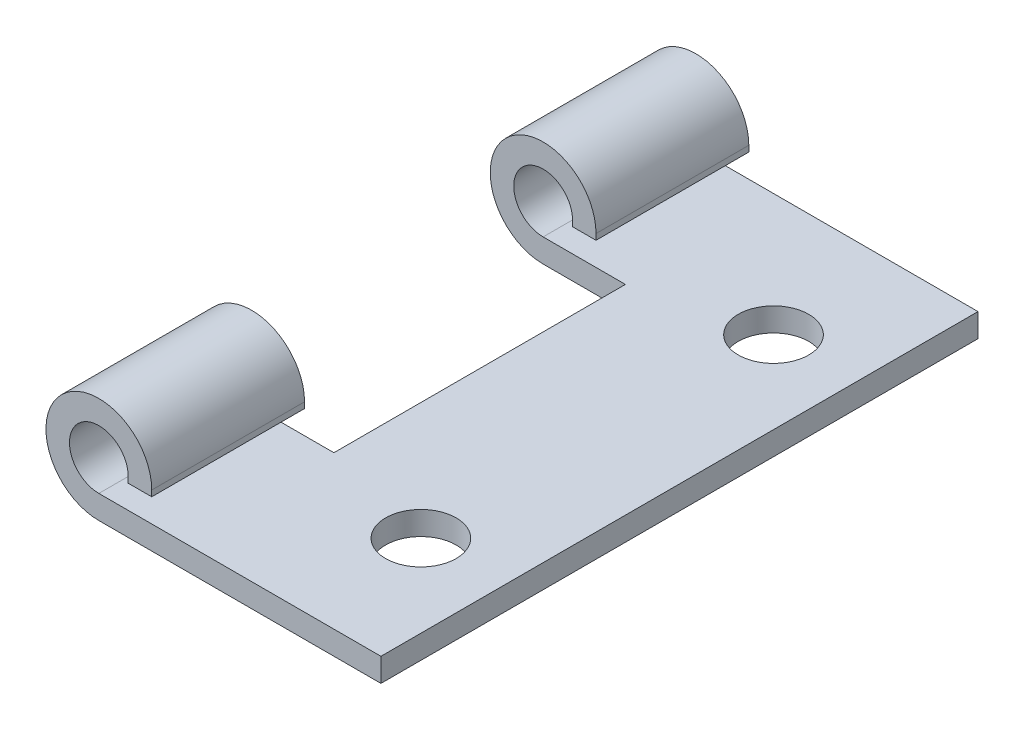
ISO-10303-21;
HEADER;
FILE_DESCRIPTION(('STEP AP214'),'2;1');
FILE_NAME('part.step','',(''),(''),'','','');
FILE_SCHEMA(('AUTOMOTIVE_DESIGN { 1 0 10303 214 1 1 1 1 }'));
ENDSEC;
DATA;
#1=APPLICATION_CONTEXT('core data for automotive mechanical design processes');
#2=APPLICATION_PROTOCOL_DEFINITION('international standard','automotive_design',2000,#1);
#3=PRODUCT_CONTEXT('',#1,'mechanical');
#4=PRODUCT('Part','Part','',(#3));
#5=PRODUCT_RELATED_PRODUCT_CATEGORY('part','',(#4));
#6=PRODUCT_DEFINITION_FORMATION('','',#4);
#7=PRODUCT_DEFINITION_CONTEXT('part definition',#1,'design');
#8=PRODUCT_DEFINITION('design','',#6,#7);
#9=PRODUCT_DEFINITION_SHAPE('','',#8);
#10=(LENGTH_UNIT() NAMED_UNIT(*) SI_UNIT(.MILLI.,.METRE.));
#11=(NAMED_UNIT(*) PLANE_ANGLE_UNIT() SI_UNIT($,.RADIAN.));
#12=(NAMED_UNIT(*) SI_UNIT($,.STERADIAN.) SOLID_ANGLE_UNIT());
#13=UNCERTAINTY_MEASURE_WITH_UNIT(LENGTH_MEASURE(1.E-05),#10,'distance_accuracy_value','');
#14=(GEOMETRIC_REPRESENTATION_CONTEXT(3) GLOBAL_UNCERTAINTY_ASSIGNED_CONTEXT((#13)) GLOBAL_UNIT_ASSIGNED_CONTEXT((#10,
#11,#12)) REPRESENTATION_CONTEXT('',''));
#15=CARTESIAN_POINT('',(0.,0.,0.));
#16=DIRECTION('',(0.,0.,1.));
#17=DIRECTION('',(1.,0.,0.));
#18=AXIS2_PLACEMENT_3D('',#15,#16,#17);
#19=CARTESIAN_POINT('',(0.,0.,25.4));
#20=DIRECTION('',(0.,0.,-1.));
#21=DIRECTION('',(-1.,0.,0.));
#22=AXIS2_PLACEMENT_3D('',#19,#20,#21);
#23=CYLINDRICAL_SURFACE('',#22,1.25);
#24=DIRECTION('',(0.,0.,-1.));
#25=VECTOR('',#24,1.);
#26=CARTESIAN_POINT('',(0.,-1.25,25.4));
#27=LINE('',#26,#25);
#28=CARTESIAN_POINT('',(0.,-1.25,25.4));
#29=VERTEX_POINT('',#28);
#30=CARTESIAN_POINT('',(0.,-1.25,18.9));
#31=VERTEX_POINT('',#30);
#32=EDGE_CURVE('E192',#29,#31,#27,.T.);
#33=ORIENTED_EDGE('',*,*,#32,.T.);
#34=CARTESIAN_POINT('',(0.,0.,18.9));
#35=DIRECTION('',(0.,0.,1.));
#36=DIRECTION('',(1.,0.,0.));
#37=AXIS2_PLACEMENT_3D('',#34,#35,#36);
#38=CIRCLE('',#37,1.25);
#39=CARTESIAN_POINT('',(1.25,0.,18.9));
#40=VERTEX_POINT('',#39);
#41=EDGE_CURVE('E292',#31,#40,#38,.F.);
#42=ORIENTED_EDGE('',*,*,#41,.T.);
#43=DIRECTION('',(0.,0.,-1.));
#44=VECTOR('',#43,1.);
#45=CARTESIAN_POINT('',(1.25,0.,25.4));
#46=LINE('',#45,#44);
#47=CARTESIAN_POINT('',(1.25,0.,25.4));
#48=VERTEX_POINT('',#47);
#49=EDGE_CURVE('E217',#48,#40,#46,.T.);
#50=ORIENTED_EDGE('',*,*,#49,.F.);
#51=CARTESIAN_POINT('',(0.,0.,25.4));
#52=DIRECTION('',(0.,0.,-1.));
#53=DIRECTION('',(1.,0.,0.));
#54=AXIS2_PLACEMENT_3D('',#51,#52,#53);
#55=CIRCLE('',#54,1.25);
#56=EDGE_CURVE('E191',#29,#48,#55,.T.);
#57=ORIENTED_EDGE('',*,*,#56,.F.);
#58=EDGE_LOOP('',(#33,#42,#50,#57));
#59=FACE_BOUND('',#58,.T.);
#60=ADVANCED_FACE('F47',(#59),#23,.F.);
#61=CARTESIAN_POINT('',(1.25,0.,25.4));
#62=DIRECTION('',(1.,0.,0.));
#63=DIRECTION('',(0.,0.,-1.));
#64=AXIS2_PLACEMENT_3D('',#61,#62,#63);
#65=PLANE('',#64);
#66=ORIENTED_EDGE('',*,*,#49,.T.);
#67=DIRECTION('',(0.,-1.,0.));
#68=VECTOR('',#67,1.);
#69=CARTESIAN_POINT('',(1.25,0.,18.9));
#70=LINE('',#69,#68);
#71=CARTESIAN_POINT('',(1.25,-0.250000000000001,18.9));
#72=VERTEX_POINT('',#71);
#73=EDGE_CURVE('E296',#40,#72,#70,.T.);
#74=ORIENTED_EDGE('',*,*,#73,.T.);
#75=DIRECTION('',(0.,0.,-1.));
#76=VECTOR('',#75,1.);
#77=CARTESIAN_POINT('',(1.25,-0.250000000000001,25.4));
#78=LINE('',#77,#76);
#79=CARTESIAN_POINT('',(1.25,-0.250000000000001,25.4));
#80=VERTEX_POINT('',#79);
#81=EDGE_CURVE('E212',#80,#72,#78,.T.);
#82=ORIENTED_EDGE('',*,*,#81,.F.);
#83=DIRECTION('',(0.,-1.,0.));
#84=VECTOR('',#83,1.);
#85=CARTESIAN_POINT('',(1.25,0.,25.4));
#86=LINE('',#85,#84);
#87=EDGE_CURVE('E115',#48,#80,#86,.T.);
#88=ORIENTED_EDGE('',*,*,#87,.F.);
#89=EDGE_LOOP('',(#66,#74,#82,#88));
#90=FACE_BOUND('',#89,.T.);
#91=ADVANCED_FACE('F352',(#90),#65,.F.);
#92=CARTESIAN_POINT('',(2.25,-0.250000000000001,25.4));
#93=DIRECTION('',(0.,1.,0.));
#94=DIRECTION('',(0.,0.,1.));
#95=AXIS2_PLACEMENT_3D('',#92,#93,#94);
#96=PLANE('',#95);
#97=ORIENTED_EDGE('',*,*,#81,.T.);
#98=DIRECTION('',(1.,0.,0.));
#99=VECTOR('',#98,1.);
#100=CARTESIAN_POINT('',(2.25,-0.250000000000001,18.9));
#101=LINE('',#100,#99);
#102=CARTESIAN_POINT('',(2.25,-0.250000000000001,18.9));
#103=VERTEX_POINT('',#102);
#104=EDGE_CURVE('E300',#72,#103,#101,.T.);
#105=ORIENTED_EDGE('',*,*,#104,.T.);
#106=DIRECTION('',(0.,0.,-1.));
#107=VECTOR('',#106,1.);
#108=CARTESIAN_POINT('',(2.25,-0.250000000000001,25.4));
#109=LINE('',#108,#107);
#110=CARTESIAN_POINT('',(2.25,-0.250000000000001,25.4));
#111=VERTEX_POINT('',#110);
#112=EDGE_CURVE('E207',#111,#103,#109,.T.);
#113=ORIENTED_EDGE('',*,*,#112,.F.);
#114=DIRECTION('',(1.,0.,0.));
#115=VECTOR('',#114,1.);
#116=CARTESIAN_POINT('',(1.25,-0.250000000000001,25.4));
#117=LINE('',#116,#115);
#118=EDGE_CURVE('E315',#80,#111,#117,.T.);
#119=ORIENTED_EDGE('',*,*,#118,.F.);
#120=EDGE_LOOP('',(#97,#105,#113,#119));
#121=FACE_BOUND('',#120,.T.);
#122=ADVANCED_FACE('F358',(#121),#96,.F.);
#123=CARTESIAN_POINT('',(2.25,0.,25.4));
#124=DIRECTION('',(-1.,0.,0.));
#125=DIRECTION('',(0.,0.,1.));
#126=AXIS2_PLACEMENT_3D('',#123,#124,#125);
#127=PLANE('',#126);
#128=ORIENTED_EDGE('',*,*,#112,.T.);
#129=DIRECTION('',(0.,1.,0.));
#130=VECTOR('',#129,1.);
#131=CARTESIAN_POINT('',(2.25,0.,18.9));
#132=LINE('',#131,#130);
#133=CARTESIAN_POINT('',(2.25,0.,18.9));
#134=VERTEX_POINT('',#133);
#135=EDGE_CURVE('E304',#103,#134,#132,.T.);
#136=ORIENTED_EDGE('',*,*,#135,.T.);
#137=DIRECTION('',(0.,0.,-1.));
#138=VECTOR('',#137,1.);
#139=CARTESIAN_POINT('',(2.25,0.,25.4));
#140=LINE('',#139,#138);
#141=CARTESIAN_POINT('',(2.25,0.,25.4));
#142=VERTEX_POINT('',#141);
#143=EDGE_CURVE('E202',#142,#134,#140,.T.);
#144=ORIENTED_EDGE('',*,*,#143,.F.);
#145=DIRECTION('',(0.,1.,0.));
#146=VECTOR('',#145,1.);
#147=CARTESIAN_POINT('',(2.25,0.,25.4));
#148=LINE('',#147,#146);
#149=EDGE_CURVE('E318',#111,#142,#148,.T.);
#150=ORIENTED_EDGE('',*,*,#149,.F.);
#151=EDGE_LOOP('',(#128,#136,#144,#150));
#152=FACE_BOUND('',#151,.T.);
#153=ADVANCED_FACE('F368',(#152),#127,.F.);
#154=CARTESIAN_POINT('',(0.,0.,25.4));
#155=DIRECTION('',(0.,0.,-1.));
#156=DIRECTION('',(-1.,0.,0.));
#157=AXIS2_PLACEMENT_3D('',#154,#155,#156);
#158=CYLINDRICAL_SURFACE('',#157,2.25);
#159=ORIENTED_EDGE('',*,*,#143,.T.);
#160=CARTESIAN_POINT('',(0.,0.,18.9));
#161=DIRECTION('',(0.,0.,1.));
#162=DIRECTION('',(1.,0.,0.));
#163=AXIS2_PLACEMENT_3D('',#160,#161,#162);
#164=CIRCLE('',#163,2.25);
#165=CARTESIAN_POINT('',(0.,-2.25,18.9));
#166=VERTEX_POINT('',#165);
#167=EDGE_CURVE('E167',#134,#166,#164,.T.);
#168=ORIENTED_EDGE('',*,*,#167,.T.);
#169=DIRECTION('',(0.,0.,-1.));
#170=VECTOR('',#169,1.);
#171=CARTESIAN_POINT('',(0.,-2.25,25.4));
#172=LINE('',#171,#170);
#173=CARTESIAN_POINT('',(0.,-2.25,25.4));
#174=VERTEX_POINT('',#173);
#175=EDGE_CURVE('E198',#174,#166,#172,.T.);
#176=ORIENTED_EDGE('',*,*,#175,.F.);
#177=CARTESIAN_POINT('',(0.,0.,25.4));
#178=DIRECTION('',(0.,0.,1.));
#179=DIRECTION('',(1.,0.,0.));
#180=AXIS2_PLACEMENT_3D('',#177,#178,#179);
#181=CIRCLE('',#180,2.25);
#182=EDGE_CURVE('E137',#142,#174,#181,.T.);
#183=ORIENTED_EDGE('',*,*,#182,.F.);
#184=EDGE_LOOP('',(#159,#168,#176,#183));
#185=FACE_BOUND('',#184,.T.);
#186=ADVANCED_FACE('F361',(#185),#158,.T.);
#187=CARTESIAN_POINT('',(1.25,0.,6.5));
#188=VERTEX_POINT('',#187);
#189=CARTESIAN_POINT('',(1.25,0.,0.));
#190=VERTEX_POINT('',#189);
#191=EDGE_CURVE('E216',#188,#190,#46,.T.);
#192=ORIENTED_EDGE('',*,*,#191,.F.);
#193=CARTESIAN_POINT('',(0.,0.,6.5));
#194=DIRECTION('',(0.,0.,-1.));
#195=DIRECTION('',(-1.,0.,0.));
#196=AXIS2_PLACEMENT_3D('',#193,#194,#195);
#197=CIRCLE('',#196,1.25);
#198=CARTESIAN_POINT('',(0.,-1.25,6.5));
#199=VERTEX_POINT('',#198);
#200=EDGE_CURVE('E230',#188,#199,#197,.F.);
#201=ORIENTED_EDGE('',*,*,#200,.T.);
#202=CARTESIAN_POINT('',(0.,-1.25,0.));
#203=VERTEX_POINT('',#202);
#204=EDGE_CURVE('E106',#199,#203,#27,.T.);
#205=ORIENTED_EDGE('',*,*,#204,.T.);
#206=CARTESIAN_POINT('',(0.,0.,0.));
#207=DIRECTION('',(0.,0.,-1.));
#208=DIRECTION('',(1.,0.,0.));
#209=AXIS2_PLACEMENT_3D('',#206,#207,#208);
#210=CIRCLE('',#209,1.25);
#211=EDGE_CURVE('E163',#203,#190,#210,.T.);
#212=ORIENTED_EDGE('',*,*,#211,.T.);
#213=EDGE_LOOP('',(#192,#201,#205,#212));
#214=FACE_BOUND('',#213,.T.);
#215=ADVANCED_FACE('F49',(#214),#23,.F.);
#216=CARTESIAN_POINT('',(1.25,-0.250000000000001,6.5));
#217=VERTEX_POINT('',#216);
#218=CARTESIAN_POINT('',(1.25,-0.250000000000001,0.));
#219=VERTEX_POINT('',#218);
#220=EDGE_CURVE('E211',#217,#219,#78,.T.);
#221=ORIENTED_EDGE('',*,*,#220,.F.);
#222=DIRECTION('',(0.,1.,0.));
#223=VECTOR('',#222,1.);
#224=CARTESIAN_POINT('',(1.25,0.,6.5));
#225=LINE('',#224,#223);
#226=EDGE_CURVE('E276',#217,#188,#225,.T.);
#227=ORIENTED_EDGE('',*,*,#226,.T.);
#228=ORIENTED_EDGE('',*,*,#191,.T.);
#229=DIRECTION('',(0.,-1.,0.));
#230=VECTOR('',#229,1.);
#231=CARTESIAN_POINT('',(1.25,0.,0.));
#232=LINE('',#231,#230);
#233=EDGE_CURVE('E166',#190,#219,#232,.T.);
#234=ORIENTED_EDGE('',*,*,#233,.T.);
#235=EDGE_LOOP('',(#221,#227,#228,#234));
#236=FACE_BOUND('',#235,.T.);
#237=ADVANCED_FACE('F359',(#236),#65,.F.);
#238=CARTESIAN_POINT('',(2.25,-0.250000000000001,6.5));
#239=VERTEX_POINT('',#238);
#240=CARTESIAN_POINT('',(2.25,-0.250000000000001,0.));
#241=VERTEX_POINT('',#240);
#242=EDGE_CURVE('E206',#239,#241,#109,.T.);
#243=ORIENTED_EDGE('',*,*,#242,.F.);
#244=DIRECTION('',(-1.,0.,0.));
#245=VECTOR('',#244,1.);
#246=CARTESIAN_POINT('',(2.25000000000001,-0.250000000000001,6.5));
#247=LINE('',#246,#245);
#248=EDGE_CURVE('E280',#239,#217,#247,.T.);
#249=ORIENTED_EDGE('',*,*,#248,.T.);
#250=ORIENTED_EDGE('',*,*,#220,.T.);
#251=DIRECTION('',(1.,0.,0.));
#252=VECTOR('',#251,1.);
#253=CARTESIAN_POINT('',(2.25,-0.250000000000001,0.));
#254=LINE('',#253,#252);
#255=EDGE_CURVE('E171',#219,#241,#254,.T.);
#256=ORIENTED_EDGE('',*,*,#255,.T.);
#257=EDGE_LOOP('',(#243,#249,#250,#256));
#258=FACE_BOUND('',#257,.T.);
#259=ADVANCED_FACE('F366',(#258),#96,.F.);
#260=CARTESIAN_POINT('',(2.25,0.,6.5));
#261=VERTEX_POINT('',#260);
#262=CARTESIAN_POINT('',(2.25,0.,0.));
#263=VERTEX_POINT('',#262);
#264=EDGE_CURVE('E201',#261,#263,#140,.T.);
#265=ORIENTED_EDGE('',*,*,#264,.F.);
#266=DIRECTION('',(0.,-1.,0.));
#267=VECTOR('',#266,1.);
#268=CARTESIAN_POINT('',(2.25,0.,6.5));
#269=LINE('',#268,#267);
#270=EDGE_CURVE('E284',#261,#239,#269,.T.);
#271=ORIENTED_EDGE('',*,*,#270,.T.);
#272=ORIENTED_EDGE('',*,*,#242,.T.);
#273=DIRECTION('',(0.,1.,0.));
#274=VECTOR('',#273,1.);
#275=CARTESIAN_POINT('',(2.25,0.,0.));
#276=LINE('',#275,#274);
#277=EDGE_CURVE('E175',#241,#263,#276,.T.);
#278=ORIENTED_EDGE('',*,*,#277,.T.);
#279=EDGE_LOOP('',(#265,#271,#272,#278));
#280=FACE_BOUND('',#279,.T.);
#281=ADVANCED_FACE('F467',(#280),#127,.F.);
#282=CARTESIAN_POINT('',(0.,0.,6.5));
#283=DIRECTION('',(0.,0.,-1.));
#284=DIRECTION('',(-1.,0.,0.));
#285=AXIS2_PLACEMENT_3D('',#282,#283,#284);
#286=CIRCLE('',#285,2.25);
#287=CARTESIAN_POINT('',(0.,-2.25,6.5));
#288=VERTEX_POINT('',#287);
#289=EDGE_CURVE('E288',#288,#261,#286,.T.);
#290=ORIENTED_EDGE('',*,*,#289,.T.);
#291=ORIENTED_EDGE('',*,*,#264,.T.);
#292=CARTESIAN_POINT('',(0.,0.,0.));
#293=DIRECTION('',(0.,0.,1.));
#294=DIRECTION('',(1.,0.,0.));
#295=AXIS2_PLACEMENT_3D('',#292,#293,#294);
#296=CIRCLE('',#295,2.25);
#297=CARTESIAN_POINT('',(0.,-2.25,0.));
#298=VERTEX_POINT('',#297);
#299=EDGE_CURVE('E179',#263,#298,#296,.T.);
#300=ORIENTED_EDGE('',*,*,#299,.T.);
#301=EDGE_CURVE('E152',#288,#298,#172,.T.);
#302=ORIENTED_EDGE('',*,*,#301,.F.);
#303=EDGE_LOOP('',(#290,#291,#300,#302));
#304=FACE_BOUND('',#303,.T.);
#305=ADVANCED_FACE('F330',(#304),#158,.T.);
#306=CARTESIAN_POINT('',(0.,-2.25,25.4));
#307=DIRECTION('',(0.,1.,0.));
#308=DIRECTION('',(0.,0.,1.));
#309=AXIS2_PLACEMENT_3D('',#306,#307,#308);
#310=PLANE('',#309);
#311=CARTESIAN_POINT('',(8.5,-2.25,5.2));
#312=DIRECTION('',(0.,-1.,0.));
#313=DIRECTION('',(0.,0.,-1.));
#314=AXIS2_PLACEMENT_3D('',#311,#312,#313);
#315=CIRCLE('',#314,1.5);
#316=CARTESIAN_POINT('',(8.5,-2.25,3.7));
#317=VERTEX_POINT('',#316);
#318=EDGE_CURVE('E270',#317,#317,#315,.T.);
#319=ORIENTED_EDGE('',*,*,#318,.F.);
#320=EDGE_LOOP('',(#319));
#321=FACE_BOUND('',#320,.T.);
#322=CARTESIAN_POINT('',(8.5,-2.25,20.2));
#323=DIRECTION('',(0.,-1.,0.));
#324=DIRECTION('',(0.,0.,-1.));
#325=AXIS2_PLACEMENT_3D('',#322,#323,#324);
#326=CIRCLE('',#325,1.5);
#327=CARTESIAN_POINT('',(8.5,-2.25,18.7));
#328=VERTEX_POINT('',#327);
#329=EDGE_CURVE('E226',#328,#328,#326,.T.);
#330=ORIENTED_EDGE('',*,*,#329,.F.);
#331=EDGE_LOOP('',(#330));
#332=FACE_BOUND('',#331,.T.);
#333=ORIENTED_EDGE('',*,*,#175,.T.);
#334=DIRECTION('',(-1.,0.,0.));
#335=VECTOR('',#334,1.);
#336=CARTESIAN_POINT('',(-2.25,-2.25,18.9));
#337=LINE('',#336,#335);
#338=CARTESIAN_POINT('',(3.5,-2.25,18.9));
#339=VERTEX_POINT('',#338);
#340=EDGE_CURVE('E259',#339,#166,#337,.T.);
#341=ORIENTED_EDGE('',*,*,#340,.F.);
#342=DIRECTION('',(0.,0.,1.));
#343=VECTOR('',#342,1.);
#344=CARTESIAN_POINT('',(3.5,-2.25,18.9));
#345=LINE('',#344,#343);
#346=CARTESIAN_POINT('',(3.5,-2.25,6.5));
#347=VERTEX_POINT('',#346);
#348=EDGE_CURVE('E252',#347,#339,#345,.T.);
#349=ORIENTED_EDGE('',*,*,#348,.F.);
#350=DIRECTION('',(1.,0.,0.));
#351=VECTOR('',#350,1.);
#352=CARTESIAN_POINT('',(-2.25,-2.25,6.5));
#353=LINE('',#352,#351);
#354=EDGE_CURVE('E267',#288,#347,#353,.T.);
#355=ORIENTED_EDGE('',*,*,#354,.F.);
#356=ORIENTED_EDGE('',*,*,#301,.T.);
#357=DIRECTION('',(1.,0.,0.));
#358=VECTOR('',#357,1.);
#359=CARTESIAN_POINT('',(0.,-2.25,0.));
#360=LINE('',#359,#358);
#361=CARTESIAN_POINT('',(12.,-2.25,0.));
#362=VERTEX_POINT('',#361);
#363=EDGE_CURVE('E147',#298,#362,#360,.T.);
#364=ORIENTED_EDGE('',*,*,#363,.T.);
#365=DIRECTION('',(0.,0.,-1.));
#366=VECTOR('',#365,1.);
#367=CARTESIAN_POINT('',(12.,-2.25,25.4));
#368=LINE('',#367,#366);
#369=CARTESIAN_POINT('',(12.,-2.25,25.4));
#370=VERTEX_POINT('',#369);
#371=EDGE_CURVE('E144',#370,#362,#368,.T.);
#372=ORIENTED_EDGE('',*,*,#371,.F.);
#373=DIRECTION('',(1.,0.,0.));
#374=VECTOR('',#373,1.);
#375=CARTESIAN_POINT('',(0.,-2.25,25.4));
#376=LINE('',#375,#374);
#377=EDGE_CURVE('E130',#174,#370,#376,.T.);
#378=ORIENTED_EDGE('',*,*,#377,.F.);
#379=EDGE_LOOP('',(#333,#341,#349,#355,#356,#364,#372,#378));
#380=FACE_BOUND('',#379,.T.);
#381=ADVANCED_FACE('F145',(#321,#332,#380),#310,.F.);
#382=CARTESIAN_POINT('',(12.,-2.25,25.4));
#383=DIRECTION('',(-1.,0.,0.));
#384=DIRECTION('',(0.,0.,1.));
#385=AXIS2_PLACEMENT_3D('',#382,#383,#384);
#386=PLANE('',#385);
#387=DIRECTION('',(0.,1.,0.));
#388=VECTOR('',#387,1.);
#389=CARTESIAN_POINT('',(12.,-2.25,0.));
#390=LINE('',#389,#388);
#391=CARTESIAN_POINT('',(12.,-1.25,0.));
#392=VERTEX_POINT('',#391);
#393=EDGE_CURVE('E185',#362,#392,#390,.T.);
#394=ORIENTED_EDGE('',*,*,#393,.T.);
#395=DIRECTION('',(0.,0.,-1.));
#396=VECTOR('',#395,1.);
#397=CARTESIAN_POINT('',(12.,-1.25,25.4));
#398=LINE('',#397,#396);
#399=CARTESIAN_POINT('',(12.,-1.25,25.4));
#400=VERTEX_POINT('',#399);
#401=EDGE_CURVE('E153',#400,#392,#398,.T.);
#402=ORIENTED_EDGE('',*,*,#401,.F.);
#403=DIRECTION('',(0.,1.,0.));
#404=VECTOR('',#403,1.);
#405=CARTESIAN_POINT('',(12.,-2.25,25.4));
#406=LINE('',#405,#404);
#407=EDGE_CURVE('E134',#370,#400,#406,.T.);
#408=ORIENTED_EDGE('',*,*,#407,.F.);
#409=ORIENTED_EDGE('',*,*,#371,.T.);
#410=EDGE_LOOP('',(#394,#402,#408,#409));
#411=FACE_BOUND('',#410,.T.);
#412=ADVANCED_FACE('F155',(#411),#386,.F.);
#413=CARTESIAN_POINT('',(1.87082869338697,-1.25,25.4));
#414=DIRECTION('',(0.,-1.,0.));
#415=DIRECTION('',(1.,0.,0.));
#416=AXIS2_PLACEMENT_3D('',#413,#414,#415);
#417=PLANE('',#416);
#418=CARTESIAN_POINT('',(8.5,-1.25000000000001,5.2));
#419=DIRECTION('',(0.,-1.,0.));
#420=DIRECTION('',(1.,0.,0.));
#421=AXIS2_PLACEMENT_3D('',#418,#419,#420);
#422=CIRCLE('',#421,1.5);
#423=CARTESIAN_POINT('',(10.,-1.25000000000001,5.2));
#424=VERTEX_POINT('',#423);
#425=EDGE_CURVE('E225',#424,#424,#422,.T.);
#426=ORIENTED_EDGE('',*,*,#425,.T.);
#427=EDGE_LOOP('',(#426));
#428=FACE_BOUND('',#427,.T.);
#429=CARTESIAN_POINT('',(8.5,-1.25000000000001,20.2));
#430=DIRECTION('',(0.,-1.,0.));
#431=DIRECTION('',(1.,0.,0.));
#432=AXIS2_PLACEMENT_3D('',#429,#430,#431);
#433=CIRCLE('',#432,1.5);
#434=CARTESIAN_POINT('',(10.,-1.25000000000001,20.2));
#435=VERTEX_POINT('',#434);
#436=EDGE_CURVE('E221',#435,#435,#433,.T.);
#437=ORIENTED_EDGE('',*,*,#436,.T.);
#438=EDGE_LOOP('',(#437));
#439=FACE_BOUND('',#438,.T.);
#440=DIRECTION('',(0.,0.,1.));
#441=VECTOR('',#440,1.);
#442=CARTESIAN_POINT('',(3.5,-1.25,25.4));
#443=LINE('',#442,#441);
#444=CARTESIAN_POINT('',(3.5,-1.25,6.5));
#445=VERTEX_POINT('',#444);
#446=CARTESIAN_POINT('',(3.5,-1.25,18.9));
#447=VERTEX_POINT('',#446);
#448=EDGE_CURVE('E56',#445,#447,#443,.T.);
#449=ORIENTED_EDGE('',*,*,#448,.T.);
#450=DIRECTION('',(-1.,0.,0.));
#451=VECTOR('',#450,1.);
#452=CARTESIAN_POINT('',(1.87082869338697,-1.25,18.9));
#453=LINE('',#452,#451);
#454=EDGE_CURVE('E11',#447,#31,#453,.T.);
#455=ORIENTED_EDGE('',*,*,#454,.T.);
#456=ORIENTED_EDGE('',*,*,#32,.F.);
#457=DIRECTION('',(-1.,0.,0.));
#458=VECTOR('',#457,1.);
#459=CARTESIAN_POINT('',(12.,-1.25,25.4));
#460=LINE('',#459,#458);
#461=EDGE_CURVE('E72',#400,#29,#460,.T.);
#462=ORIENTED_EDGE('',*,*,#461,.F.);
#463=ORIENTED_EDGE('',*,*,#401,.T.);
#464=DIRECTION('',(-1.,0.,0.));
#465=VECTOR('',#464,1.);
#466=CARTESIAN_POINT('',(1.87082869338697,-1.25,0.));
#467=LINE('',#466,#465);
#468=EDGE_CURVE('E188',#392,#203,#467,.T.);
#469=ORIENTED_EDGE('',*,*,#468,.T.);
#470=ORIENTED_EDGE('',*,*,#204,.F.);
#471=DIRECTION('',(1.,0.,0.));
#472=VECTOR('',#471,1.);
#473=CARTESIAN_POINT('',(1.87082869338698,-1.25,6.5));
#474=LINE('',#473,#472);
#475=EDGE_CURVE('E220',#199,#445,#474,.T.);
#476=ORIENTED_EDGE('',*,*,#475,.T.);
#477=EDGE_LOOP('',(#449,#455,#456,#462,#463,#469,#470,#476));
#478=FACE_BOUND('',#477,.T.);
#479=ADVANCED_FACE('F237',(#428,#439,#478),#417,.F.);
#480=CARTESIAN_POINT('',(0.,0.,25.4));
#481=DIRECTION('',(0.,0.,1.));
#482=DIRECTION('',(1.,0.,0.));
#483=AXIS2_PLACEMENT_3D('',#480,#481,#482);
#484=PLANE('',#483);
#485=ORIENTED_EDGE('',*,*,#56,.T.);
#486=ORIENTED_EDGE('',*,*,#87,.T.);
#487=ORIENTED_EDGE('',*,*,#118,.T.);
#488=ORIENTED_EDGE('',*,*,#149,.T.);
#489=ORIENTED_EDGE('',*,*,#182,.T.);
#490=ORIENTED_EDGE('',*,*,#377,.T.);
#491=ORIENTED_EDGE('',*,*,#407,.T.);
#492=ORIENTED_EDGE('',*,*,#461,.T.);
#493=EDGE_LOOP('',(#485,#486,#487,#488,#489,#490,#491,#492));
#494=FACE_BOUND('',#493,.T.);
#495=ADVANCED_FACE('F132',(#494),#484,.T.);
#496=CARTESIAN_POINT('',(0.,0.,0.));
#497=DIRECTION('',(0.,0.,1.));
#498=DIRECTION('',(1.,0.,0.));
#499=AXIS2_PLACEMENT_3D('',#496,#497,#498);
#500=PLANE('',#499);
#501=ORIENTED_EDGE('',*,*,#211,.F.);
#502=ORIENTED_EDGE('',*,*,#468,.F.);
#503=ORIENTED_EDGE('',*,*,#393,.F.);
#504=ORIENTED_EDGE('',*,*,#363,.F.);
#505=ORIENTED_EDGE('',*,*,#299,.F.);
#506=ORIENTED_EDGE('',*,*,#277,.F.);
#507=ORIENTED_EDGE('',*,*,#255,.F.);
#508=ORIENTED_EDGE('',*,*,#233,.F.);
#509=EDGE_LOOP('',(#501,#502,#503,#504,#505,#506,#507,#508));
#510=FACE_BOUND('',#509,.T.);
#511=ADVANCED_FACE('F337',(#510),#500,.F.);
#512=CARTESIAN_POINT('',(8.5,2.25,20.2));
#513=DIRECTION('',(0.,-1.,0.));
#514=DIRECTION('',(0.,0.,-1.));
#515=AXIS2_PLACEMENT_3D('',#512,#513,#514);
#516=CYLINDRICAL_SURFACE('',#515,1.5);
#517=ORIENTED_EDGE('',*,*,#329,.T.);
#518=EDGE_LOOP('',(#517));
#519=FACE_BOUND('',#518,.T.);
#520=ORIENTED_EDGE('',*,*,#436,.F.);
#521=EDGE_LOOP('',(#520));
#522=FACE_BOUND('',#521,.T.);
#523=ADVANCED_FACE('F334',(#519,#522),#516,.F.);
#524=CARTESIAN_POINT('',(8.5,2.25,5.2));
#525=DIRECTION('',(0.,-1.,0.));
#526=DIRECTION('',(0.,0.,-1.));
#527=AXIS2_PLACEMENT_3D('',#524,#525,#526);
#528=CYLINDRICAL_SURFACE('',#527,1.5);
#529=ORIENTED_EDGE('',*,*,#318,.T.);
#530=EDGE_LOOP('',(#529));
#531=FACE_BOUND('',#530,.T.);
#532=ORIENTED_EDGE('',*,*,#425,.F.);
#533=EDGE_LOOP('',(#532));
#534=FACE_BOUND('',#533,.T.);
#535=ADVANCED_FACE('F325',(#531,#534),#528,.F.);
#536=CARTESIAN_POINT('',(-2.25,2.25,18.9));
#537=DIRECTION('',(0.,0.,1.));
#538=DIRECTION('',(1.,0.,0.));
#539=AXIS2_PLACEMENT_3D('',#536,#537,#538);
#540=PLANE('',#539);
#541=ORIENTED_EDGE('',*,*,#167,.F.);
#542=ORIENTED_EDGE('',*,*,#135,.F.);
#543=ORIENTED_EDGE('',*,*,#104,.F.);
#544=ORIENTED_EDGE('',*,*,#73,.F.);
#545=ORIENTED_EDGE('',*,*,#41,.F.);
#546=ORIENTED_EDGE('',*,*,#454,.F.);
#547=DIRECTION('',(0.,-1.,0.));
#548=VECTOR('',#547,1.);
#549=CARTESIAN_POINT('',(3.5,2.25,18.9));
#550=LINE('',#549,#548);
#551=EDGE_CURVE('E249',#447,#339,#550,.T.);
#552=ORIENTED_EDGE('',*,*,#551,.T.);
#553=ORIENTED_EDGE('',*,*,#340,.T.);
#554=EDGE_LOOP('',(#541,#542,#543,#544,#545,#546,#552,#553));
#555=FACE_BOUND('',#554,.T.);
#556=ADVANCED_FACE('F414',(#555),#540,.F.);
#557=CARTESIAN_POINT('',(3.5,2.25,18.9));
#558=DIRECTION('',(1.,0.,0.));
#559=DIRECTION('',(0.,0.,-1.));
#560=AXIS2_PLACEMENT_3D('',#557,#558,#559);
#561=PLANE('',#560);
#562=DIRECTION('',(0.,-1.,0.));
#563=VECTOR('',#562,1.);
#564=CARTESIAN_POINT('',(3.5,2.25,6.5));
#565=LINE('',#564,#563);
#566=EDGE_CURVE('E63',#445,#347,#565,.T.);
#567=ORIENTED_EDGE('',*,*,#566,.T.);
#568=ORIENTED_EDGE('',*,*,#348,.T.);
#569=ORIENTED_EDGE('',*,*,#551,.F.);
#570=ORIENTED_EDGE('',*,*,#448,.F.);
#571=EDGE_LOOP('',(#567,#568,#569,#570));
#572=FACE_BOUND('',#571,.T.);
#573=ADVANCED_FACE('F245',(#572),#561,.F.);
#574=CARTESIAN_POINT('',(-2.25,2.25,6.5));
#575=DIRECTION('',(0.,0.,-1.));
#576=DIRECTION('',(-1.,0.,0.));
#577=AXIS2_PLACEMENT_3D('',#574,#575,#576);
#578=PLANE('',#577);
#579=ORIENTED_EDGE('',*,*,#354,.T.);
#580=ORIENTED_EDGE('',*,*,#566,.F.);
#581=ORIENTED_EDGE('',*,*,#475,.F.);
#582=ORIENTED_EDGE('',*,*,#200,.F.);
#583=ORIENTED_EDGE('',*,*,#226,.F.);
#584=ORIENTED_EDGE('',*,*,#248,.F.);
#585=ORIENTED_EDGE('',*,*,#270,.F.);
#586=ORIENTED_EDGE('',*,*,#289,.F.);
#587=EDGE_LOOP('',(#579,#580,#581,#582,#583,#584,#585,#586));
#588=FACE_BOUND('',#587,.T.);
#589=ADVANCED_FACE('F421',(#588),#578,.F.);
#590=CLOSED_SHELL('',(#60,#91,#122,#153,#186,#215,#237,#259,#281,#305,#381,#412,#479,#495,#511,
#523,#535,#556,#573,#589));
#591=MANIFOLD_SOLID_BREP('B2',#590);
#592=ADVANCED_BREP_SHAPE_REPRESENTATION('',(#18,#591),#14);
#593=SHAPE_DEFINITION_REPRESENTATION(#9,#592);
ENDSEC;
END-ISO-10303-21;
